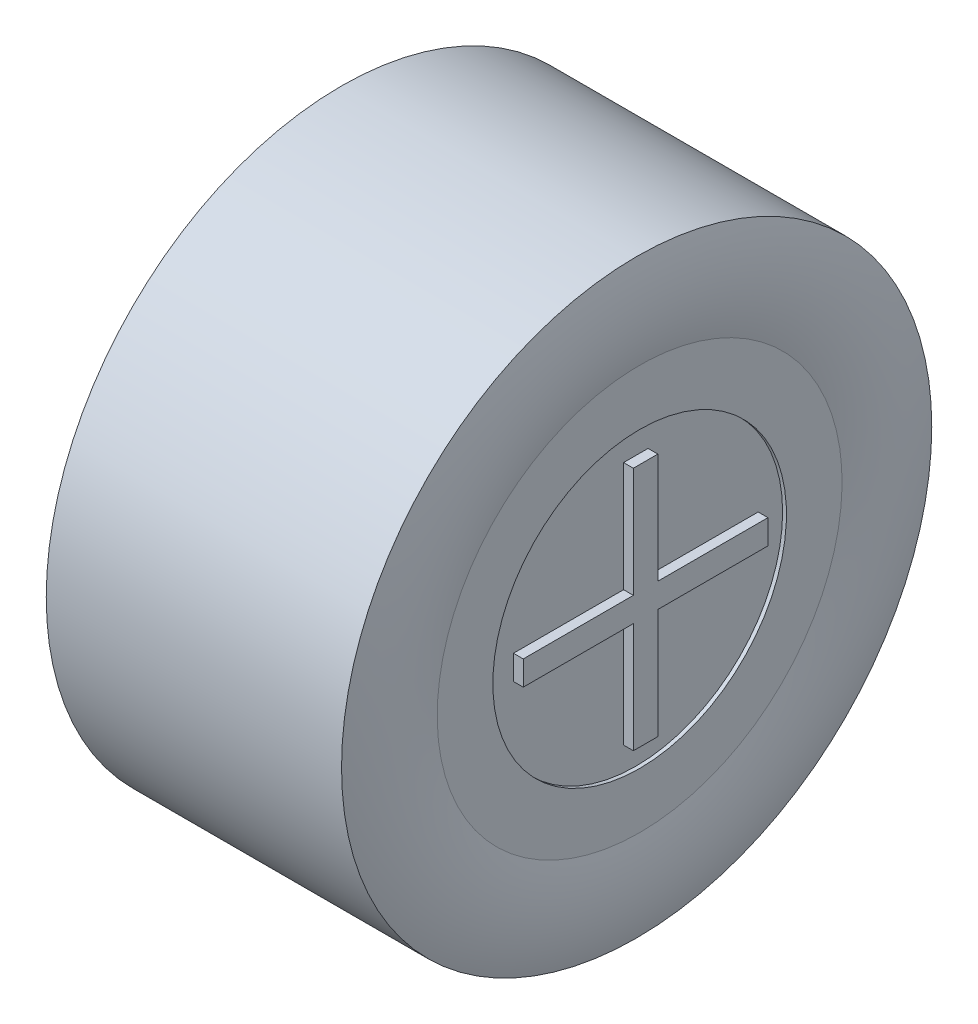
ISO-10303-21;
HEADER;
FILE_DESCRIPTION(('STEP AP214'),'2;1');
FILE_NAME('part.step','',(''),(''),'','','');
FILE_SCHEMA(('AUTOMOTIVE_DESIGN { 1 0 10303 214 1 1 1 1 }'));
ENDSEC;
DATA;
#1=APPLICATION_CONTEXT('core data for automotive mechanical design processes');
#2=APPLICATION_PROTOCOL_DEFINITION('international standard','automotive_design',2000,#1);
#3=PRODUCT_CONTEXT('',#1,'mechanical');
#4=PRODUCT('Part','Part','',(#3));
#5=PRODUCT_RELATED_PRODUCT_CATEGORY('part','',(#4));
#6=PRODUCT_DEFINITION_FORMATION('','',#4);
#7=PRODUCT_DEFINITION_CONTEXT('part definition',#1,'design');
#8=PRODUCT_DEFINITION('design','',#6,#7);
#9=PRODUCT_DEFINITION_SHAPE('','',#8);
#10=(LENGTH_UNIT() NAMED_UNIT(*) SI_UNIT(.MILLI.,.METRE.));
#11=(NAMED_UNIT(*) PLANE_ANGLE_UNIT() SI_UNIT($,.RADIAN.));
#12=(NAMED_UNIT(*) SI_UNIT($,.STERADIAN.) SOLID_ANGLE_UNIT());
#13=UNCERTAINTY_MEASURE_WITH_UNIT(LENGTH_MEASURE(1.E-05),#10,'distance_accuracy_value','');
#14=(GEOMETRIC_REPRESENTATION_CONTEXT(3) GLOBAL_UNCERTAINTY_ASSIGNED_CONTEXT((#13)) GLOBAL_UNIT_ASSIGNED_CONTEXT((#10,
#11,#12)) REPRESENTATION_CONTEXT('',''));
#15=CARTESIAN_POINT('',(0.,0.,0.));
#16=DIRECTION('',(0.,0.,1.));
#17=DIRECTION('',(1.,0.,0.));
#18=AXIS2_PLACEMENT_3D('',#15,#16,#17);
#19=CARTESIAN_POINT('',(30.,0.,0.));
#20=DIRECTION('',(1.,0.,0.));
#21=DIRECTION('',(0.,0.,-1.));
#22=AXIS2_PLACEMENT_3D('',#19,#20,#21);
#23=PLANE('',#22);
#24=CARTESIAN_POINT('',(30.,0.,0.));
#25=DIRECTION('',(1.,0.,0.));
#26=DIRECTION('',(0.,0.,-1.));
#27=AXIS2_PLACEMENT_3D('',#24,#25,#26);
#28=CIRCLE('',#27,30.);
#29=CARTESIAN_POINT('',(30.,0.,-30.));
#30=VERTEX_POINT('',#29);
#31=EDGE_CURVE('E158',#30,#30,#28,.T.);
#32=ORIENTED_EDGE('',*,*,#31,.T.);
#33=EDGE_LOOP('',(#32));
#34=FACE_BOUND('',#33,.T.);
#35=DIRECTION('',(0.,-1.,0.));
#36=VECTOR('',#35,1.);
#37=CARTESIAN_POINT('',(30.,0.,2.5));
#38=LINE('',#37,#36);
#39=CARTESIAN_POINT('',(30.,25.,2.5));
#40=VERTEX_POINT('',#39);
#41=CARTESIAN_POINT('',(30.,2.5,2.5));
#42=VERTEX_POINT('',#41);
#43=EDGE_CURVE('E58',#40,#42,#38,.T.);
#44=ORIENTED_EDGE('',*,*,#43,.F.);
#45=DIRECTION('',(0.,0.,1.));
#46=VECTOR('',#45,1.);
#47=CARTESIAN_POINT('',(30.,25.,0.));
#48=LINE('',#47,#46);
#49=CARTESIAN_POINT('',(30.,25.,-2.5));
#50=VERTEX_POINT('',#49);
#51=EDGE_CURVE('E154',#50,#40,#48,.T.);
#52=ORIENTED_EDGE('',*,*,#51,.F.);
#53=DIRECTION('',(0.,-1.,0.));
#54=VECTOR('',#53,1.);
#55=CARTESIAN_POINT('',(30.,0.,-2.5));
#56=LINE('',#55,#54);
#57=CARTESIAN_POINT('',(30.,2.5,-2.5));
#58=VERTEX_POINT('',#57);
#59=EDGE_CURVE('E151',#50,#58,#56,.T.);
#60=ORIENTED_EDGE('',*,*,#59,.T.);
#61=DIRECTION('',(0.,0.,-1.));
#62=VECTOR('',#61,1.);
#63=CARTESIAN_POINT('',(30.,2.5,0.));
#64=LINE('',#63,#62);
#65=CARTESIAN_POINT('',(30.,2.5,-25.));
#66=VERTEX_POINT('',#65);
#67=EDGE_CURVE('E540',#58,#66,#64,.T.);
#68=ORIENTED_EDGE('',*,*,#67,.T.);
#69=DIRECTION('',(0.,-1.,0.));
#70=VECTOR('',#69,1.);
#71=CARTESIAN_POINT('',(30.,0.,-25.));
#72=LINE('',#71,#70);
#73=CARTESIAN_POINT('',(30.,-2.5,-25.));
#74=VERTEX_POINT('',#73);
#75=EDGE_CURVE('E542',#66,#74,#72,.T.);
#76=ORIENTED_EDGE('',*,*,#75,.T.);
#77=DIRECTION('',(0.,0.,-1.));
#78=VECTOR('',#77,1.);
#79=CARTESIAN_POINT('',(30.,-2.5,0.));
#80=LINE('',#79,#78);
#81=CARTESIAN_POINT('',(30.,-2.5,-2.5));
#82=VERTEX_POINT('',#81);
#83=EDGE_CURVE('E589',#82,#74,#80,.T.);
#84=ORIENTED_EDGE('',*,*,#83,.F.);
#85=DIRECTION('',(0.,-1.,0.));
#86=VECTOR('',#85,1.);
#87=CARTESIAN_POINT('',(30.,0.,-2.5));
#88=LINE('',#87,#86);
#89=CARTESIAN_POINT('',(30.,-25.,-2.5));
#90=VERTEX_POINT('',#89);
#91=EDGE_CURVE('E587',#82,#90,#88,.T.);
#92=ORIENTED_EDGE('',*,*,#91,.T.);
#93=DIRECTION('',(0.,0.,1.));
#94=VECTOR('',#93,1.);
#95=CARTESIAN_POINT('',(30.,-25.,0.));
#96=LINE('',#95,#94);
#97=CARTESIAN_POINT('',(30.,-25.,2.5));
#98=VERTEX_POINT('',#97);
#99=EDGE_CURVE('E585',#90,#98,#96,.T.);
#100=ORIENTED_EDGE('',*,*,#99,.T.);
#101=DIRECTION('',(0.,-1.,0.));
#102=VECTOR('',#101,1.);
#103=CARTESIAN_POINT('',(30.,0.,2.5));
#104=LINE('',#103,#102);
#105=CARTESIAN_POINT('',(30.,-2.5,2.5));
#106=VERTEX_POINT('',#105);
#107=EDGE_CURVE('E582',#106,#98,#104,.T.);
#108=ORIENTED_EDGE('',*,*,#107,.F.);
#109=DIRECTION('',(0.,0.,-1.));
#110=VECTOR('',#109,1.);
#111=CARTESIAN_POINT('',(30.,-2.5,0.));
#112=LINE('',#111,#110);
#113=CARTESIAN_POINT('',(30.,-2.5,25.));
#114=VERTEX_POINT('',#113);
#115=EDGE_CURVE('E575',#114,#106,#112,.T.);
#116=ORIENTED_EDGE('',*,*,#115,.F.);
#117=DIRECTION('',(0.,-1.,0.));
#118=VECTOR('',#117,1.);
#119=CARTESIAN_POINT('',(30.,0.,25.));
#120=LINE('',#119,#118);
#121=CARTESIAN_POINT('',(30.,2.5,25.));
#122=VERTEX_POINT('',#121);
#123=EDGE_CURVE('E572',#122,#114,#120,.T.);
#124=ORIENTED_EDGE('',*,*,#123,.F.);
#125=DIRECTION('',(0.,0.,-1.));
#126=VECTOR('',#125,1.);
#127=CARTESIAN_POINT('',(30.,2.5,0.));
#128=LINE('',#127,#126);
#129=EDGE_CURVE('E63',#122,#42,#128,.T.);
#130=ORIENTED_EDGE('',*,*,#129,.T.);
#131=EDGE_LOOP('',(#44,#52,#60,#68,#76,#84,#92,#100,#108,#116,#124,#130));
#132=FACE_BOUND('',#131,.T.);
#133=ADVANCED_FACE('F41',(#34,#132),#23,.T.);
#134=CARTESIAN_POINT('',(-80.6535607493196,0.,0.));
#135=DIRECTION('',(-1.,0.,0.));
#136=DIRECTION('',(0.,-1.,0.));
#137=AXIS2_PLACEMENT_3D('',#134,#135,#136);
#138=CYLINDRICAL_SURFACE('',#137,30.);
#139=CARTESIAN_POINT('',(-30.7818119286805,0.,0.));
#140=DIRECTION('',(-1.,0.,0.));
#141=DIRECTION('',(0.,-1.,0.));
#142=AXIS2_PLACEMENT_3D('',#139,#140,#141);
#143=CIRCLE('',#142,30.);
#144=CARTESIAN_POINT('',(-30.7818119286805,-30.,0.));
#145=VERTEX_POINT('',#144);
#146=EDGE_CURVE('E256',#145,#145,#143,.T.);
#147=ORIENTED_EDGE('',*,*,#146,.T.);
#148=EDGE_LOOP('',(#147));
#149=FACE_BOUND('',#148,.T.);
#150=CARTESIAN_POINT('',(-30.,0.,0.));
#151=DIRECTION('',(1.,0.,0.));
#152=DIRECTION('',(0.,0.,-1.));
#153=AXIS2_PLACEMENT_3D('',#150,#151,#152);
#154=CIRCLE('',#153,30.);
#155=CARTESIAN_POINT('',(-30.,0.,-30.));
#156=VERTEX_POINT('',#155);
#157=EDGE_CURVE('E51',#156,#156,#154,.F.);
#158=ORIENTED_EDGE('',*,*,#157,.F.);
#159=EDGE_LOOP('',(#158));
#160=FACE_BOUND('',#159,.T.);
#161=ADVANCED_FACE('F265',(#149,#160),#138,.F.);
#162=CARTESIAN_POINT('',(-30.7818119286805,30.,0.));
#163=DIRECTION('',(1.,0.,0.));
#164=DIRECTION('',(0.,1.,0.));
#165=AXIS2_PLACEMENT_3D('',#162,#163,#164);
#166=PLANE('',#165);
#167=ORIENTED_EDGE('',*,*,#146,.F.);
#168=EDGE_LOOP('',(#167));
#169=FACE_BOUND('',#168,.T.);
#170=CARTESIAN_POINT('',(-30.7818119286805,0.,0.));
#171=DIRECTION('',(-1.,0.,0.));
#172=DIRECTION('',(0.,-1.,0.));
#173=AXIS2_PLACEMENT_3D('',#170,#171,#172);
#174=CIRCLE('',#173,41.3646241331419);
#175=CARTESIAN_POINT('',(-30.7818119286805,-41.3646241331418,0.));
#176=VERTEX_POINT('',#175);
#177=EDGE_CURVE('E253',#176,#176,#174,.T.);
#178=ORIENTED_EDGE('',*,*,#177,.T.);
#179=EDGE_LOOP('',(#178));
#180=FACE_BOUND('',#179,.T.);
#181=ADVANCED_FACE('F220',(#169,#180),#166,.F.);
#182=CARTESIAN_POINT('',(-30.1715902193962,60.3044283000212,0.));
#183=CARTESIAN_POINT('',(-33.1631614911437,50.9503913846076,0.));
#184=CARTESIAN_POINT('',(-30.7818119286805,41.3646241331419,0.));
#185=B_SPLINE_CURVE_WITH_KNOTS('',2,(#182,#183,#184),.UNSPECIFIED.,.F.,.F.,(3,3),(0.,1.),.UNSPECIFIED.);
#186=CARTESIAN_POINT('',(-80.6535607493196,0.,0.));
#187=DIRECTION('',(-1.,0.,0.));
#188=AXIS1_PLACEMENT('',#186,#187);
#189=SURFACE_OF_REVOLUTION('',#185,#188);
#190=ORIENTED_EDGE('',*,*,#177,.F.);
#191=EDGE_LOOP('',(#190));
#192=FACE_BOUND('',#191,.T.);
#193=CARTESIAN_POINT('',(-30.1715902193962,0.,0.));
#194=DIRECTION('',(-1.,0.,0.));
#195=DIRECTION('',(0.,-1.,0.));
#196=AXIS2_PLACEMENT_3D('',#193,#194,#195);
#197=CIRCLE('',#196,60.3044283000212);
#198=CARTESIAN_POINT('',(-30.1715902193962,-60.3044283000212,0.));
#199=VERTEX_POINT('',#198);
#200=EDGE_CURVE('E250',#199,#199,#197,.T.);
#201=ORIENTED_EDGE('',*,*,#200,.T.);
#202=EDGE_LOOP('',(#201));
#203=FACE_BOUND('',#202,.T.);
#204=ADVANCED_FACE('F216',(#192,#203),#189,.T.);
#205=CARTESIAN_POINT('',(-80.6535607493196,0.,0.));
#206=DIRECTION('',(-1.,0.,0.));
#207=DIRECTION('',(0.,-1.,0.));
#208=AXIS2_PLACEMENT_3D('',#205,#206,#207);
#209=CYLINDRICAL_SURFACE('',#208,60.3044283000212);
#210=ORIENTED_EDGE('',*,*,#200,.F.);
#211=EDGE_LOOP('',(#210));
#212=FACE_BOUND('',#211,.T.);
#213=CARTESIAN_POINT('',(30.1715902193963,0.,0.));
#214=DIRECTION('',(-1.,0.,0.));
#215=DIRECTION('',(0.,-1.,0.));
#216=AXIS2_PLACEMENT_3D('',#213,#214,#215);
#217=CIRCLE('',#216,60.3044283000212);
#218=CARTESIAN_POINT('',(30.1715902193963,-60.3044283000212,0.));
#219=VERTEX_POINT('',#218);
#220=EDGE_CURVE('E247',#219,#219,#217,.T.);
#221=ORIENTED_EDGE('',*,*,#220,.T.);
#222=EDGE_LOOP('',(#221));
#223=FACE_BOUND('',#222,.T.);
#224=ADVANCED_FACE('F212',(#212,#223),#209,.T.);
#225=CARTESIAN_POINT('',(30.7818119286805,41.3646241331419,0.));
#226=CARTESIAN_POINT('',(33.1631614911437,50.9503913846076,0.));
#227=CARTESIAN_POINT('',(30.1715902193962,60.3044283000212,0.));
#228=B_SPLINE_CURVE_WITH_KNOTS('',2,(#225,#226,#227),.UNSPECIFIED.,.F.,.F.,(3,3),(0.,1.),.UNSPECIFIED.);
#229=CARTESIAN_POINT('',(-80.6535607493196,0.,0.));
#230=DIRECTION('',(-1.,0.,0.));
#231=AXIS1_PLACEMENT('',#229,#230);
#232=SURFACE_OF_REVOLUTION('',#228,#231);
#233=ORIENTED_EDGE('',*,*,#220,.F.);
#234=EDGE_LOOP('',(#233));
#235=FACE_BOUND('',#234,.T.);
#236=CARTESIAN_POINT('',(30.7818119286806,0.,0.));
#237=DIRECTION('',(-1.,0.,0.));
#238=DIRECTION('',(0.,-1.,0.));
#239=AXIS2_PLACEMENT_3D('',#236,#237,#238);
#240=CIRCLE('',#239,41.3646241331418);
#241=CARTESIAN_POINT('',(30.7818119286806,-41.3646241331418,0.));
#242=VERTEX_POINT('',#241);
#243=EDGE_CURVE('E244',#242,#242,#240,.T.);
#244=ORIENTED_EDGE('',*,*,#243,.T.);
#245=EDGE_LOOP('',(#244));
#246=FACE_BOUND('',#245,.T.);
#247=ADVANCED_FACE('F208',(#235,#246),#232,.T.);
#248=CARTESIAN_POINT('',(30.7818119286805,30.,0.));
#249=DIRECTION('',(-1.,0.,0.));
#250=DIRECTION('',(0.,-1.,0.));
#251=AXIS2_PLACEMENT_3D('',#248,#249,#250);
#252=PLANE('',#251);
#253=ORIENTED_EDGE('',*,*,#243,.F.);
#254=EDGE_LOOP('',(#253));
#255=FACE_BOUND('',#254,.T.);
#256=CARTESIAN_POINT('',(30.7818119286806,0.,0.));
#257=DIRECTION('',(-1.,0.,0.));
#258=DIRECTION('',(0.,-1.,0.));
#259=AXIS2_PLACEMENT_3D('',#256,#257,#258);
#260=CIRCLE('',#259,30.);
#261=CARTESIAN_POINT('',(30.7818119286806,-30.,0.));
#262=VERTEX_POINT('',#261);
#263=EDGE_CURVE('E241',#262,#262,#260,.T.);
#264=ORIENTED_EDGE('',*,*,#263,.T.);
#265=EDGE_LOOP('',(#264));
#266=FACE_BOUND('',#265,.T.);
#267=ADVANCED_FACE('F204',(#255,#266),#252,.F.);
#268=CARTESIAN_POINT('',(-80.6535607493196,0.,0.));
#269=DIRECTION('',(-1.,0.,0.));
#270=DIRECTION('',(0.,-1.,0.));
#271=AXIS2_PLACEMENT_3D('',#268,#269,#270);
#272=CYLINDRICAL_SURFACE('',#271,30.);
#273=ORIENTED_EDGE('',*,*,#31,.F.);
#274=EDGE_LOOP('',(#273));
#275=FACE_BOUND('',#274,.T.);
#276=ORIENTED_EDGE('',*,*,#263,.F.);
#277=EDGE_LOOP('',(#276));
#278=FACE_BOUND('',#277,.T.);
#279=ADVANCED_FACE('F200',(#275,#278),#272,.F.);
#280=CARTESIAN_POINT('',(-30.,0.,0.));
#281=DIRECTION('',(1.,0.,0.));
#282=DIRECTION('',(0.,0.,-1.));
#283=AXIS2_PLACEMENT_3D('',#280,#281,#282);
#284=PLANE('',#283);
#285=CARTESIAN_POINT('',(-30.,0.,0.));
#286=DIRECTION('',(1.,0.,0.));
#287=DIRECTION('',(0.,0.,-1.));
#288=AXIS2_PLACEMENT_3D('',#285,#286,#287);
#289=CIRCLE('',#288,8.);
#290=CARTESIAN_POINT('',(-30.,0.,-8.));
#291=VERTEX_POINT('',#290);
#292=EDGE_CURVE('E11',#291,#291,#289,.F.);
#293=ORIENTED_EDGE('',*,*,#292,.F.);
#294=EDGE_LOOP('',(#293));
#295=FACE_BOUND('',#294,.T.);
#296=ORIENTED_EDGE('',*,*,#157,.T.);
#297=EDGE_LOOP('',(#296));
#298=FACE_BOUND('',#297,.T.);
#299=ADVANCED_FACE('F203',(#295,#298),#284,.F.);
#300=CARTESIAN_POINT('',(-60.,0.,0.));
#301=DIRECTION('',(1.,0.,0.));
#302=DIRECTION('',(0.,0.,-1.));
#303=AXIS2_PLACEMENT_3D('',#300,#301,#302);
#304=CYLINDRICAL_SURFACE('',#303,8.);
#305=CARTESIAN_POINT('',(-60.,0.,0.));
#306=DIRECTION('',(-1.,0.,0.));
#307=DIRECTION('',(0.,0.,1.));
#308=AXIS2_PLACEMENT_3D('',#305,#306,#307);
#309=CIRCLE('',#308,8.);
#310=CARTESIAN_POINT('',(-60.,0.,8.));
#311=VERTEX_POINT('',#310);
#312=EDGE_CURVE('E155',#311,#311,#309,.T.);
#313=ORIENTED_EDGE('',*,*,#312,.F.);
#314=EDGE_LOOP('',(#313));
#315=FACE_BOUND('',#314,.T.);
#316=ORIENTED_EDGE('',*,*,#292,.T.);
#317=EDGE_LOOP('',(#316));
#318=FACE_BOUND('',#317,.T.);
#319=ADVANCED_FACE('F295',(#315,#318),#304,.T.);
#320=CARTESIAN_POINT('',(-60.,0.,0.));
#321=DIRECTION('',(-1.,0.,0.));
#322=DIRECTION('',(0.,0.,1.));
#323=AXIS2_PLACEMENT_3D('',#320,#321,#322);
#324=PLANE('',#323);
#325=ORIENTED_EDGE('',*,*,#312,.T.);
#326=EDGE_LOOP('',(#325));
#327=FACE_BOUND('',#326,.T.);
#328=ADVANCED_FACE('F300',(#327),#324,.T.);
#329=CARTESIAN_POINT('',(32.,25.,0.));
#330=DIRECTION('',(0.,-1.,0.));
#331=DIRECTION('',(0.,0.,-1.));
#332=AXIS2_PLACEMENT_3D('',#329,#330,#331);
#333=PLANE('',#332);
#334=ORIENTED_EDGE('',*,*,#51,.T.);
#335=DIRECTION('',(-1.,0.,0.));
#336=VECTOR('',#335,1.);
#337=CARTESIAN_POINT('',(32.,25.,2.5));
#338=LINE('',#337,#336);
#339=CARTESIAN_POINT('',(32.,25.,2.5));
#340=VERTEX_POINT('',#339);
#341=EDGE_CURVE('E134',#340,#40,#338,.T.);
#342=ORIENTED_EDGE('',*,*,#341,.F.);
#343=DIRECTION('',(0.,0.,1.));
#344=VECTOR('',#343,1.);
#345=CARTESIAN_POINT('',(32.,25.,0.));
#346=LINE('',#345,#344);
#347=CARTESIAN_POINT('',(32.,25.,-2.5));
#348=VERTEX_POINT('',#347);
#349=EDGE_CURVE('E141',#348,#340,#346,.T.);
#350=ORIENTED_EDGE('',*,*,#349,.F.);
#351=DIRECTION('',(-1.,0.,0.));
#352=VECTOR('',#351,1.);
#353=CARTESIAN_POINT('',(32.,25.,-2.5));
#354=LINE('',#353,#352);
#355=EDGE_CURVE('E537',#348,#50,#354,.T.);
#356=ORIENTED_EDGE('',*,*,#355,.T.);
#357=EDGE_LOOP('',(#334,#342,#350,#356));
#358=FACE_BOUND('',#357,.T.);
#359=ADVANCED_FACE('F153',(#358),#333,.F.);
#360=CARTESIAN_POINT('',(32.,0.,2.5));
#361=DIRECTION('',(0.,0.,-1.));
#362=DIRECTION('',(0.,1.,0.));
#363=AXIS2_PLACEMENT_3D('',#360,#361,#362);
#364=PLANE('',#363);
#365=ORIENTED_EDGE('',*,*,#43,.T.);
#366=DIRECTION('',(-1.,0.,0.));
#367=VECTOR('',#366,1.);
#368=CARTESIAN_POINT('',(32.,2.5,2.5));
#369=LINE('',#368,#367);
#370=CARTESIAN_POINT('',(32.,2.5,2.5));
#371=VERTEX_POINT('',#370);
#372=EDGE_CURVE('E136',#371,#42,#369,.T.);
#373=ORIENTED_EDGE('',*,*,#372,.F.);
#374=DIRECTION('',(0.,-1.,0.));
#375=VECTOR('',#374,1.);
#376=CARTESIAN_POINT('',(32.,0.,2.5));
#377=LINE('',#376,#375);
#378=EDGE_CURVE('E130',#340,#371,#377,.T.);
#379=ORIENTED_EDGE('',*,*,#378,.F.);
#380=ORIENTED_EDGE('',*,*,#341,.T.);
#381=EDGE_LOOP('',(#365,#373,#379,#380));
#382=FACE_BOUND('',#381,.T.);
#383=ADVANCED_FACE('F132',(#382),#364,.F.);
#384=CARTESIAN_POINT('',(32.,2.5,0.));
#385=DIRECTION('',(0.,1.,0.));
#386=DIRECTION('',(0.,0.,1.));
#387=AXIS2_PLACEMENT_3D('',#384,#385,#386);
#388=PLANE('',#387);
#389=ORIENTED_EDGE('',*,*,#129,.F.);
#390=DIRECTION('',(-1.,0.,0.));
#391=VECTOR('',#390,1.);
#392=CARTESIAN_POINT('',(32.,2.5,25.));
#393=LINE('',#392,#391);
#394=CARTESIAN_POINT('',(32.,2.5,25.));
#395=VERTEX_POINT('',#394);
#396=EDGE_CURVE('E160',#395,#122,#393,.T.);
#397=ORIENTED_EDGE('',*,*,#396,.F.);
#398=DIRECTION('',(0.,0.,-1.));
#399=VECTOR('',#398,1.);
#400=CARTESIAN_POINT('',(32.,2.5,0.));
#401=LINE('',#400,#399);
#402=EDGE_CURVE('E140',#395,#371,#401,.T.);
#403=ORIENTED_EDGE('',*,*,#402,.T.);
#404=ORIENTED_EDGE('',*,*,#372,.T.);
#405=EDGE_LOOP('',(#389,#397,#403,#404));
#406=FACE_BOUND('',#405,.T.);
#407=ADVANCED_FACE('F309',(#406),#388,.T.);
#408=CARTESIAN_POINT('',(32.,0.,25.));
#409=DIRECTION('',(0.,0.,-1.));
#410=DIRECTION('',(-1.,0.,0.));
#411=AXIS2_PLACEMENT_3D('',#408,#409,#410);
#412=PLANE('',#411);
#413=ORIENTED_EDGE('',*,*,#123,.T.);
#414=DIRECTION('',(-1.,0.,0.));
#415=VECTOR('',#414,1.);
#416=CARTESIAN_POINT('',(32.,-2.5,25.));
#417=LINE('',#416,#415);
#418=CARTESIAN_POINT('',(32.,-2.5,25.));
#419=VERTEX_POINT('',#418);
#420=EDGE_CURVE('E566',#419,#114,#417,.T.);
#421=ORIENTED_EDGE('',*,*,#420,.F.);
#422=DIRECTION('',(0.,-1.,0.));
#423=VECTOR('',#422,1.);
#424=CARTESIAN_POINT('',(32.,0.,25.));
#425=LINE('',#424,#423);
#426=EDGE_CURVE('E573',#395,#419,#425,.T.);
#427=ORIENTED_EDGE('',*,*,#426,.F.);
#428=ORIENTED_EDGE('',*,*,#396,.T.);
#429=EDGE_LOOP('',(#413,#421,#427,#428));
#430=FACE_BOUND('',#429,.T.);
#431=ADVANCED_FACE('F312',(#430),#412,.F.);
#432=CARTESIAN_POINT('',(32.,-2.5,0.));
#433=DIRECTION('',(0.,1.,0.));
#434=DIRECTION('',(0.,0.,1.));
#435=AXIS2_PLACEMENT_3D('',#432,#433,#434);
#436=PLANE('',#435);
#437=ORIENTED_EDGE('',*,*,#115,.T.);
#438=DIRECTION('',(-1.,0.,0.));
#439=VECTOR('',#438,1.);
#440=CARTESIAN_POINT('',(32.,-2.5,2.5));
#441=LINE('',#440,#439);
#442=CARTESIAN_POINT('',(32.,-2.5,2.5));
#443=VERTEX_POINT('',#442);
#444=EDGE_CURVE('E563',#443,#106,#441,.T.);
#445=ORIENTED_EDGE('',*,*,#444,.F.);
#446=DIRECTION('',(0.,0.,-1.));
#447=VECTOR('',#446,1.);
#448=CARTESIAN_POINT('',(32.,-2.5,0.));
#449=LINE('',#448,#447);
#450=EDGE_CURVE('E610',#419,#443,#449,.T.);
#451=ORIENTED_EDGE('',*,*,#450,.F.);
#452=ORIENTED_EDGE('',*,*,#420,.T.);
#453=EDGE_LOOP('',(#437,#445,#451,#452));
#454=FACE_BOUND('',#453,.T.);
#455=ADVANCED_FACE('F316',(#454),#436,.F.);
#456=CARTESIAN_POINT('',(32.,0.,2.5));
#457=DIRECTION('',(0.,0.,-1.));
#458=DIRECTION('',(0.,1.,0.));
#459=AXIS2_PLACEMENT_3D('',#456,#457,#458);
#460=PLANE('',#459);
#461=ORIENTED_EDGE('',*,*,#107,.T.);
#462=DIRECTION('',(-1.,0.,0.));
#463=VECTOR('',#462,1.);
#464=CARTESIAN_POINT('',(32.,-25.,2.5));
#465=LINE('',#464,#463);
#466=CARTESIAN_POINT('',(32.,-25.,2.5));
#467=VERTEX_POINT('',#466);
#468=EDGE_CURVE('E560',#467,#98,#465,.T.);
#469=ORIENTED_EDGE('',*,*,#468,.F.);
#470=DIRECTION('',(0.,-1.,0.));
#471=VECTOR('',#470,1.);
#472=CARTESIAN_POINT('',(32.,0.,2.5));
#473=LINE('',#472,#471);
#474=EDGE_CURVE('E608',#443,#467,#473,.T.);
#475=ORIENTED_EDGE('',*,*,#474,.F.);
#476=ORIENTED_EDGE('',*,*,#444,.T.);
#477=EDGE_LOOP('',(#461,#469,#475,#476));
#478=FACE_BOUND('',#477,.T.);
#479=ADVANCED_FACE('F320',(#478),#460,.F.);
#480=CARTESIAN_POINT('',(32.,-25.,0.));
#481=DIRECTION('',(0.,-1.,0.));
#482=DIRECTION('',(0.,0.,-1.));
#483=AXIS2_PLACEMENT_3D('',#480,#481,#482);
#484=PLANE('',#483);
#485=ORIENTED_EDGE('',*,*,#99,.F.);
#486=DIRECTION('',(-1.,0.,0.));
#487=VECTOR('',#486,1.);
#488=CARTESIAN_POINT('',(32.,-25.,-2.5));
#489=LINE('',#488,#487);
#490=CARTESIAN_POINT('',(32.,-25.,-2.5));
#491=VERTEX_POINT('',#490);
#492=EDGE_CURVE('E557',#491,#90,#489,.T.);
#493=ORIENTED_EDGE('',*,*,#492,.F.);
#494=DIRECTION('',(0.,0.,1.));
#495=VECTOR('',#494,1.);
#496=CARTESIAN_POINT('',(32.,-25.,0.));
#497=LINE('',#496,#495);
#498=EDGE_CURVE('E605',#491,#467,#497,.T.);
#499=ORIENTED_EDGE('',*,*,#498,.T.);
#500=ORIENTED_EDGE('',*,*,#468,.T.);
#501=EDGE_LOOP('',(#485,#493,#499,#500));
#502=FACE_BOUND('',#501,.T.);
#503=ADVANCED_FACE('F324',(#502),#484,.T.);
#504=CARTESIAN_POINT('',(32.,0.,-2.5));
#505=DIRECTION('',(0.,0.,-1.));
#506=DIRECTION('',(0.,1.,0.));
#507=AXIS2_PLACEMENT_3D('',#504,#505,#506);
#508=PLANE('',#507);
#509=ORIENTED_EDGE('',*,*,#91,.F.);
#510=DIRECTION('',(-1.,0.,0.));
#511=VECTOR('',#510,1.);
#512=CARTESIAN_POINT('',(32.,-2.5,-2.5));
#513=LINE('',#512,#511);
#514=CARTESIAN_POINT('',(32.,-2.5,-2.5));
#515=VERTEX_POINT('',#514);
#516=EDGE_CURVE('E554',#515,#82,#513,.T.);
#517=ORIENTED_EDGE('',*,*,#516,.F.);
#518=DIRECTION('',(0.,-1.,0.));
#519=VECTOR('',#518,1.);
#520=CARTESIAN_POINT('',(32.,0.,-2.5));
#521=LINE('',#520,#519);
#522=EDGE_CURVE('E617',#515,#491,#521,.T.);
#523=ORIENTED_EDGE('',*,*,#522,.T.);
#524=ORIENTED_EDGE('',*,*,#492,.T.);
#525=EDGE_LOOP('',(#509,#517,#523,#524));
#526=FACE_BOUND('',#525,.T.);
#527=ADVANCED_FACE('F328',(#526),#508,.T.);
#528=CARTESIAN_POINT('',(32.,-2.5,0.));
#529=DIRECTION('',(0.,1.,0.));
#530=DIRECTION('',(0.,0.,1.));
#531=AXIS2_PLACEMENT_3D('',#528,#529,#530);
#532=PLANE('',#531);
#533=ORIENTED_EDGE('',*,*,#83,.T.);
#534=DIRECTION('',(-1.,0.,0.));
#535=VECTOR('',#534,1.);
#536=CARTESIAN_POINT('',(32.,-2.5,-25.));
#537=LINE('',#536,#535);
#538=CARTESIAN_POINT('',(32.,-2.5,-25.));
#539=VERTEX_POINT('',#538);
#540=EDGE_CURVE('E551',#539,#74,#537,.T.);
#541=ORIENTED_EDGE('',*,*,#540,.F.);
#542=DIRECTION('',(0.,0.,-1.));
#543=VECTOR('',#542,1.);
#544=CARTESIAN_POINT('',(32.,-2.5,0.));
#545=LINE('',#544,#543);
#546=EDGE_CURVE('E598',#515,#539,#545,.T.);
#547=ORIENTED_EDGE('',*,*,#546,.F.);
#548=ORIENTED_EDGE('',*,*,#516,.T.);
#549=EDGE_LOOP('',(#533,#541,#547,#548));
#550=FACE_BOUND('',#549,.T.);
#551=ADVANCED_FACE('F332',(#550),#532,.F.);
#552=CARTESIAN_POINT('',(32.,0.,-25.));
#553=DIRECTION('',(0.,0.,-1.));
#554=DIRECTION('',(-1.,0.,0.));
#555=AXIS2_PLACEMENT_3D('',#552,#553,#554);
#556=PLANE('',#555);
#557=ORIENTED_EDGE('',*,*,#75,.F.);
#558=DIRECTION('',(-1.,0.,0.));
#559=VECTOR('',#558,1.);
#560=CARTESIAN_POINT('',(32.,2.5,-25.));
#561=LINE('',#560,#559);
#562=CARTESIAN_POINT('',(32.,2.5,-25.));
#563=VERTEX_POINT('',#562);
#564=EDGE_CURVE('E548',#563,#66,#561,.T.);
#565=ORIENTED_EDGE('',*,*,#564,.F.);
#566=DIRECTION('',(0.,-1.,0.));
#567=VECTOR('',#566,1.);
#568=CARTESIAN_POINT('',(32.,0.,-25.));
#569=LINE('',#568,#567);
#570=EDGE_CURVE('E595',#563,#539,#569,.T.);
#571=ORIENTED_EDGE('',*,*,#570,.T.);
#572=ORIENTED_EDGE('',*,*,#540,.T.);
#573=EDGE_LOOP('',(#557,#565,#571,#572));
#574=FACE_BOUND('',#573,.T.);
#575=ADVANCED_FACE('F336',(#574),#556,.T.);
#576=CARTESIAN_POINT('',(32.,2.5,0.));
#577=DIRECTION('',(0.,1.,0.));
#578=DIRECTION('',(0.,0.,1.));
#579=AXIS2_PLACEMENT_3D('',#576,#577,#578);
#580=PLANE('',#579);
#581=ORIENTED_EDGE('',*,*,#67,.F.);
#582=DIRECTION('',(-1.,0.,0.));
#583=VECTOR('',#582,1.);
#584=CARTESIAN_POINT('',(32.,2.5,-2.5));
#585=LINE('',#584,#583);
#586=CARTESIAN_POINT('',(32.,2.5,-2.5));
#587=VERTEX_POINT('',#586);
#588=EDGE_CURVE('E538',#587,#58,#585,.T.);
#589=ORIENTED_EDGE('',*,*,#588,.F.);
#590=DIRECTION('',(0.,0.,-1.));
#591=VECTOR('',#590,1.);
#592=CARTESIAN_POINT('',(32.,2.5,0.));
#593=LINE('',#592,#591);
#594=EDGE_CURVE('E621',#587,#563,#593,.T.);
#595=ORIENTED_EDGE('',*,*,#594,.T.);
#596=ORIENTED_EDGE('',*,*,#564,.T.);
#597=EDGE_LOOP('',(#581,#589,#595,#596));
#598=FACE_BOUND('',#597,.T.);
#599=ADVANCED_FACE('F340',(#598),#580,.T.);
#600=CARTESIAN_POINT('',(32.,0.,-2.5));
#601=DIRECTION('',(0.,0.,-1.));
#602=DIRECTION('',(0.,1.,0.));
#603=AXIS2_PLACEMENT_3D('',#600,#601,#602);
#604=PLANE('',#603);
#605=ORIENTED_EDGE('',*,*,#59,.F.);
#606=ORIENTED_EDGE('',*,*,#355,.F.);
#607=DIRECTION('',(0.,-1.,0.));
#608=VECTOR('',#607,1.);
#609=CARTESIAN_POINT('',(32.,0.,-2.5));
#610=LINE('',#609,#608);
#611=EDGE_CURVE('E148',#348,#587,#610,.T.);
#612=ORIENTED_EDGE('',*,*,#611,.T.);
#613=ORIENTED_EDGE('',*,*,#588,.T.);
#614=EDGE_LOOP('',(#605,#606,#612,#613));
#615=FACE_BOUND('',#614,.T.);
#616=ADVANCED_FACE('F344',(#615),#604,.T.);
#617=CARTESIAN_POINT('',(32.,0.,0.));
#618=DIRECTION('',(1.,0.,0.));
#619=DIRECTION('',(0.,0.,-1.));
#620=AXIS2_PLACEMENT_3D('',#617,#618,#619);
#621=PLANE('',#620);
#622=ORIENTED_EDGE('',*,*,#349,.T.);
#623=ORIENTED_EDGE('',*,*,#378,.T.);
#624=ORIENTED_EDGE('',*,*,#402,.F.);
#625=ORIENTED_EDGE('',*,*,#426,.T.);
#626=ORIENTED_EDGE('',*,*,#450,.T.);
#627=ORIENTED_EDGE('',*,*,#474,.T.);
#628=ORIENTED_EDGE('',*,*,#498,.F.);
#629=ORIENTED_EDGE('',*,*,#522,.F.);
#630=ORIENTED_EDGE('',*,*,#546,.T.);
#631=ORIENTED_EDGE('',*,*,#570,.F.);
#632=ORIENTED_EDGE('',*,*,#594,.F.);
#633=ORIENTED_EDGE('',*,*,#611,.F.);
#634=EDGE_LOOP('',(#622,#623,#624,#625,#626,#627,#628,#629,#630,#631,#632,#633));
#635=FACE_BOUND('',#634,.T.);
#636=ADVANCED_FACE('F145',(#635),#621,.T.);
#637=CLOSED_SHELL('',(#133,#161,#181,#204,#224,#247,#267,#279,#299,#319,#328,#359,#383,#407,
#431,#455,#479,#503,#527,#551,#575,#599,#616,#636));
#638=CARTESIAN_POINT('',(30.,0.,0.));
#639=DIRECTION('',(-1.,0.,0.));
#640=DIRECTION('',(0.,0.,1.));
#641=AXIS2_PLACEMENT_3D('',#638,#639,#640);
#642=CYLINDRICAL_SURFACE('',#641,30.);
#643=CARTESIAN_POINT('',(27.8781745096087,0.,0.));
#644=DIRECTION('',(-1.,0.,0.));
#645=DIRECTION('',(0.,-1.,0.));
#646=AXIS2_PLACEMENT_3D('',#643,#644,#645);
#647=CIRCLE('',#646,30.);
#648=CARTESIAN_POINT('',(27.8781745096087,-30.,0.));
#649=VERTEX_POINT('',#648);
#650=EDGE_CURVE('E238',#649,#649,#647,.T.);
#651=ORIENTED_EDGE('',*,*,#650,.T.);
#652=EDGE_LOOP('',(#651));
#653=FACE_BOUND('',#652,.T.);
#654=CARTESIAN_POINT('',(-27.8781745096087,0.,0.));
#655=DIRECTION('',(-1.,0.,0.));
#656=DIRECTION('',(0.,-1.,0.));
#657=AXIS2_PLACEMENT_3D('',#654,#655,#656);
#658=CIRCLE('',#657,30.);
#659=CARTESIAN_POINT('',(-27.8781745096087,-30.,0.));
#660=VERTEX_POINT('',#659);
#661=EDGE_CURVE('E166',#660,#660,#658,.F.);
#662=ORIENTED_EDGE('',*,*,#661,.T.);
#663=EDGE_LOOP('',(#662));
#664=FACE_BOUND('',#663,.T.);
#665=ADVANCED_FACE('F283',(#653,#664),#642,.T.);
#666=CARTESIAN_POINT('',(-27.8781745096088,41.71989367416,0.));
#667=CARTESIAN_POINT('',(-27.9216185916233,41.894749248418,0.));
#668=CARTESIAN_POINT('',(-28.0113783795099,42.252720207937,0.));
#669=CARTESIAN_POINT('',(-28.1641033742223,42.9035312925109,0.));
#670=CARTESIAN_POINT('',(-28.4109860280384,44.0692473563329,0.));
#671=CARTESIAN_POINT('',(-28.7885206910167,46.3678811359494,0.));
#672=CARTESIAN_POINT('',(-29.015805627572,49.637320271337,0.));
#673=CARTESIAN_POINT('',(-28.793463146413,53.513952659258,0.));
#674=CARTESIAN_POINT('',(-28.304701892059,56.124903441554,0.));
#675=CARTESIAN_POINT('',(-27.9834456399673,57.400896506501,0.));
#676=B_SPLINE_CURVE_WITH_KNOTS('',3,(#666,#667,#668,#669,#670,#671,#672,#673,#674,#675),
.UNSPECIFIED.,.F.,.F.,(4,1,1,1,1,1,1,4),(0.117139278288512,0.145290689787366,0.173442101286221,
0.22974492428393,0.342350570279349,0.567561862270186,0.792773154261023,1.01798444625186),.UNSPECIFIED.);
#677=CARTESIAN_POINT('',(-80.6535607493196,0.,0.));
#678=DIRECTION('',(-1.,0.,0.));
#679=AXIS1_PLACEMENT('',#677,#678);
#680=SURFACE_OF_REVOLUTION('',#676,#679);
#681=CARTESIAN_POINT('',(-28.3166533354968,0.,0.));
#682=DIRECTION('',(-1.,0.,0.));
#683=DIRECTION('',(0.,-1.,0.));
#684=AXIS2_PLACEMENT_3D('',#681,#682,#683);
#685=CIRCLE('',#684,55.9318592180162);
#686=CARTESIAN_POINT('',(-28.3166533354968,-55.9318592180162,0.));
#687=VERTEX_POINT('',#686);
#688=EDGE_CURVE('E168',#687,#687,#685,.T.);
#689=ORIENTED_EDGE('',*,*,#688,.F.);
#690=EDGE_LOOP('',(#689));
#691=FACE_BOUND('',#690,.T.);
#692=CARTESIAN_POINT('',(-27.8781745096087,0.,0.));
#693=DIRECTION('',(-1.,0.,0.));
#694=DIRECTION('',(0.,-1.,0.));
#695=AXIS2_PLACEMENT_3D('',#692,#693,#694);
#696=CIRCLE('',#695,41.71989367416);
#697=CARTESIAN_POINT('',(-27.8781745096087,-41.71989367416,0.));
#698=VERTEX_POINT('',#697);
#699=EDGE_CURVE('E259',#698,#698,#696,.T.);
#700=ORIENTED_EDGE('',*,*,#699,.T.);
#701=EDGE_LOOP('',(#700));
#702=FACE_BOUND('',#701,.T.);
#703=ADVANCED_FACE('F43',(#691,#702),#680,.T.);
#704=CARTESIAN_POINT('',(-27.8781745096087,30.,0.));
#705=DIRECTION('',(-1.,0.,0.));
#706=DIRECTION('',(0.,-1.,0.));
#707=AXIS2_PLACEMENT_3D('',#704,#705,#706);
#708=PLANE('',#707);
#709=ORIENTED_EDGE('',*,*,#699,.F.);
#710=EDGE_LOOP('',(#709));
#711=FACE_BOUND('',#710,.T.);
#712=ORIENTED_EDGE('',*,*,#661,.F.);
#713=EDGE_LOOP('',(#712));
#714=FACE_BOUND('',#713,.T.);
#715=ADVANCED_FACE('F275',(#711,#714),#708,.F.);
#716=CARTESIAN_POINT('',(-80.6535607493196,0.,0.));
#717=DIRECTION('',(-1.,0.,0.));
#718=DIRECTION('',(0.,-1.,0.));
#719=AXIS2_PLACEMENT_3D('',#716,#717,#718);
#720=CYLINDRICAL_SURFACE('',#719,55.9318592180162);
#721=CARTESIAN_POINT('',(28.3166533354969,0.,0.));
#722=DIRECTION('',(-1.,0.,0.));
#723=DIRECTION('',(0.,-1.,0.));
#724=AXIS2_PLACEMENT_3D('',#721,#722,#723);
#725=CIRCLE('',#724,55.9318592180162);
#726=CARTESIAN_POINT('',(28.3166533354969,-55.9318592180162,0.));
#727=VERTEX_POINT('',#726);
#728=EDGE_CURVE('E232',#727,#727,#725,.T.);
#729=ORIENTED_EDGE('',*,*,#728,.F.);
#730=EDGE_LOOP('',(#729));
#731=FACE_BOUND('',#730,.T.);
#732=ORIENTED_EDGE('',*,*,#688,.T.);
#733=EDGE_LOOP('',(#732));
#734=FACE_BOUND('',#733,.T.);
#735=ADVANCED_FACE('F193',(#731,#734),#720,.F.);
#736=CARTESIAN_POINT('',(28.3166533354969,55.9318592180162,0.));
#737=CARTESIAN_POINT('',(28.4845547247435,55.3504660538735,0.));
#738=CARTESIAN_POINT('',(28.7004771405116,54.4830837677013,0.));
#739=CARTESIAN_POINT('',(28.9190700871438,53.3328219165211,0.));
#740=CARTESIAN_POINT('',(29.0268873005519,52.6218169908718,0.));
#741=CARTESIAN_POINT('',(29.2072218884471,51.140275095237,0.));
#742=CARTESIAN_POINT('',(29.3046027690584,48.7797214384907,0.));
#743=CARTESIAN_POINT('',(28.9987138752421,45.9558424603312,0.));
#744=CARTESIAN_POINT('',(28.5303618731274,43.8755836982274,0.));
#745=CARTESIAN_POINT('',(28.2278503332718,42.8113849779484,0.));
#746=CARTESIAN_POINT('',(28.0447943131244,42.2274030068032,0.));
#747=CARTESIAN_POINT('',(27.9319791321322,41.8848362080288,0.));
#748=CARTESIAN_POINT('',(27.8781745096088,41.71989367416,0.));
#749=B_SPLINE_CURVE_WITH_KNOTS('',3,(#736,#737,#738,#739,#740,#741,#742,#743,#744,#745,#746,
#747,#748),.UNSPECIFIED.,.F.,.F.,(4,1,1,1,1,1,1,1,1,1,4),(0.120715305794625,0.233549811901188,
0.285972838550543,0.342390091603824,0.370598718130465,0.572053330220875,0.797722342434,
0.910556848540563,0.966974101593844,0.995182728120484,1.02339135464712),.UNSPECIFIED.);
#750=CARTESIAN_POINT('',(-80.6535607493196,0.,0.));
#751=DIRECTION('',(-1.,0.,0.));
#752=AXIS1_PLACEMENT('',#750,#751);
#753=SURFACE_OF_REVOLUTION('',#749,#752);
#754=CARTESIAN_POINT('',(27.8781745096087,0.,0.));
#755=DIRECTION('',(-1.,0.,0.));
#756=DIRECTION('',(0.,-1.,0.));
#757=AXIS2_PLACEMENT_3D('',#754,#755,#756);
#758=CIRCLE('',#757,41.71989367416);
#759=CARTESIAN_POINT('',(27.8781745096087,-41.71989367416,0.));
#760=VERTEX_POINT('',#759);
#761=EDGE_CURVE('E235',#760,#760,#758,.T.);
#762=ORIENTED_EDGE('',*,*,#761,.F.);
#763=EDGE_LOOP('',(#762));
#764=FACE_BOUND('',#763,.T.);
#765=ORIENTED_EDGE('',*,*,#728,.T.);
#766=EDGE_LOOP('',(#765));
#767=FACE_BOUND('',#766,.T.);
#768=ADVANCED_FACE('F188',(#764,#767),#753,.T.);
#769=CARTESIAN_POINT('',(27.8781745096087,30.,0.));
#770=DIRECTION('',(1.,0.,0.));
#771=DIRECTION('',(0.,1.,0.));
#772=AXIS2_PLACEMENT_3D('',#769,#770,#771);
#773=PLANE('',#772);
#774=ORIENTED_EDGE('',*,*,#650,.F.);
#775=EDGE_LOOP('',(#774));
#776=FACE_BOUND('',#775,.T.);
#777=ORIENTED_EDGE('',*,*,#761,.T.);
#778=EDGE_LOOP('',(#777));
#779=FACE_BOUND('',#778,.T.);
#780=ADVANCED_FACE('F192',(#776,#779),#773,.F.);
#781=CLOSED_SHELL('',(#665,#703,#715,#735,#768,#780));
#782=ORIENTED_CLOSED_SHELL('',*,#781,.T.);
#783=BREP_WITH_VOIDS('B2',#637,(#782));
#784=ADVANCED_BREP_SHAPE_REPRESENTATION('',(#18,#783),#14);
#785=SHAPE_DEFINITION_REPRESENTATION(#9,#784);
ENDSEC;
END-ISO-10303-21;
